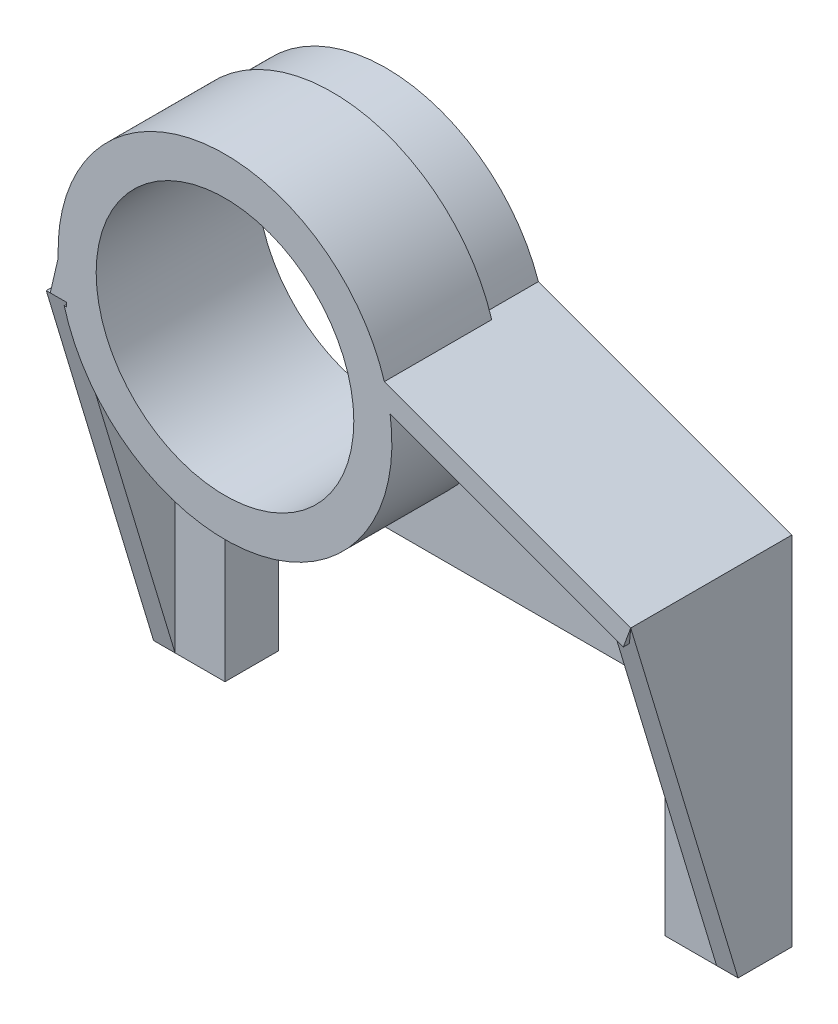
ISO-10303-21;
HEADER;
FILE_DESCRIPTION(('STEP AP214'),'2;1');
FILE_NAME('part.step','',(''),(''),'','','');
FILE_SCHEMA(('AUTOMOTIVE_DESIGN { 1 0 10303 214 1 1 1 1 }'));
ENDSEC;
DATA;
#1=APPLICATION_CONTEXT('core data for automotive mechanical design processes');
#2=APPLICATION_PROTOCOL_DEFINITION('international standard','automotive_design',2000,#1);
#3=PRODUCT_CONTEXT('',#1,'mechanical');
#4=PRODUCT('Part','Part','',(#3));
#5=PRODUCT_RELATED_PRODUCT_CATEGORY('part','',(#4));
#6=PRODUCT_DEFINITION_FORMATION('','',#4);
#7=PRODUCT_DEFINITION_CONTEXT('part definition',#1,'design');
#8=PRODUCT_DEFINITION('design','',#6,#7);
#9=PRODUCT_DEFINITION_SHAPE('','',#8);
#10=(LENGTH_UNIT() NAMED_UNIT(*) SI_UNIT(.MILLI.,.METRE.));
#11=(NAMED_UNIT(*) PLANE_ANGLE_UNIT() SI_UNIT($,.RADIAN.));
#12=(NAMED_UNIT(*) SI_UNIT($,.STERADIAN.) SOLID_ANGLE_UNIT());
#13=UNCERTAINTY_MEASURE_WITH_UNIT(LENGTH_MEASURE(1.E-05),#10,'distance_accuracy_value','');
#14=(GEOMETRIC_REPRESENTATION_CONTEXT(3) GLOBAL_UNCERTAINTY_ASSIGNED_CONTEXT((#13)) GLOBAL_UNIT_ASSIGNED_CONTEXT((#10,
#11,#12)) REPRESENTATION_CONTEXT('',''));
#15=CARTESIAN_POINT('',(0.,0.,0.));
#16=DIRECTION('',(0.,0.,1.));
#17=DIRECTION('',(1.,0.,0.));
#18=AXIS2_PLACEMENT_3D('',#15,#16,#17);
#19=CARTESIAN_POINT('',(-10.4999999999999,27.0627219974459,15.));
#20=DIRECTION('',(0.,0.,-1.));
#21=DIRECTION('',(-1.,0.,0.));
#22=AXIS2_PLACEMENT_3D('',#19,#20,#21);
#23=CYLINDRICAL_SURFACE('',#22,15.5477575567131);
#24=DIRECTION('',(0.,0.,-1.));
#25=VECTOR('',#24,1.);
#26=CARTESIAN_POINT('',(4.87771865813112,29.3558713414047,15.));
#27=LINE('',#26,#25);
#28=CARTESIAN_POINT('',(4.87771865813112,29.3558713414047,15.));
#29=VERTEX_POINT('',#28);
#30=CARTESIAN_POINT('',(4.87771865813112,29.3558713414047,5.));
#31=VERTEX_POINT('',#30);
#32=EDGE_CURVE('E224',#29,#31,#27,.T.);
#33=ORIENTED_EDGE('',*,*,#32,.F.);
#34=CARTESIAN_POINT('',(-10.4999999999999,27.0627219974459,15.));
#35=DIRECTION('',(0.,0.,1.));
#36=DIRECTION('',(1.,0.,0.));
#37=AXIS2_PLACEMENT_3D('',#34,#35,#36);
#38=CIRCLE('',#37,15.5477575567131);
#39=CARTESIAN_POINT('',(-25.4773850163848,22.8901085342437,15.));
#40=VERTEX_POINT('',#39);
#41=EDGE_CURVE('E239',#40,#29,#38,.T.);
#42=ORIENTED_EDGE('',*,*,#41,.F.);
#43=DIRECTION('',(0.,0.,-1.));
#44=VECTOR('',#43,1.);
#45=CARTESIAN_POINT('',(-25.4773850163848,22.8901085342437,14.9999999999991));
#46=LINE('',#45,#44);
#47=CARTESIAN_POINT('',(-25.4773850163848,22.8901085342437,14.8832534168398));
#48=VERTEX_POINT('',#47);
#49=EDGE_CURVE('E11',#40,#48,#46,.T.);
#50=ORIENTED_EDGE('',*,*,#49,.T.);
#51=CARTESIAN_POINT('',(-10.4999999999999,27.0627219974459,16.1388061624931));
#52=DIRECTION('',(0.,-0.288141267617881,0.957587912358735));
#53=DIRECTION('',(0.,-0.957587912358735,-0.288141267617881));
#54=AXIS2_PLACEMENT_3D('',#51,#52,#53);
#55=ELLIPSE('',#54,16.2363761656262,15.5477575567131);
#56=CARTESIAN_POINT('',(-25.1500000000005,21.8559701268159,14.5720778602535));
#57=VERTEX_POINT('',#56);
#58=EDGE_CURVE('E241',#57,#48,#55,.F.);
#59=ORIENTED_EDGE('',*,*,#58,.F.);
#60=DIRECTION('',(0.,0.,-1.));
#61=VECTOR('',#60,1.);
#62=CARTESIAN_POINT('',(-25.1500000000005,21.8559701268159,15.));
#63=LINE('',#62,#61);
#64=CARTESIAN_POINT('',(-25.1500000000005,21.8559701268159,5.));
#65=VERTEX_POINT('',#64);
#66=EDGE_CURVE('E351',#57,#65,#63,.T.);
#67=ORIENTED_EDGE('',*,*,#66,.T.);
#68=CARTESIAN_POINT('',(-10.4999999999999,27.0627219974459,5.));
#69=DIRECTION('',(0.,0.,1.));
#70=DIRECTION('',(1.,0.,0.));
#71=AXIS2_PLACEMENT_3D('',#68,#69,#70);
#72=CIRCLE('',#71,15.5477575567131);
#73=EDGE_CURVE('E238',#65,#31,#72,.T.);
#74=ORIENTED_EDGE('',*,*,#73,.T.);
#75=EDGE_LOOP('',(#33,#42,#50,#59,#67,#74));
#76=FACE_BOUND('',#75,.T.);
#77=ADVANCED_FACE('F32',(#76),#23,.T.);
#78=CARTESIAN_POINT('',(-10.4999999999999,27.0627219974459,5.));
#79=DIRECTION('',(0.,0.,1.));
#80=DIRECTION('',(1.,0.,0.));
#81=AXIS2_PLACEMENT_3D('',#78,#79,#80);
#82=PLANE('',#81);
#83=DIRECTION('',(0.,1.,0.));
#84=VECTOR('',#83,1.);
#85=CARTESIAN_POINT('',(25.2932589024681,-9.9551832387312,5.));
#86=LINE('',#85,#84);
#87=CARTESIAN_POINT('',(25.2932589024681,-9.9551832387312,5.));
#88=VERTEX_POINT('',#87);
#89=CARTESIAN_POINT('',(25.2932589024681,21.8805558147809,5.));
#90=VERTEX_POINT('',#89);
#91=EDGE_CURVE('E272',#88,#90,#86,.T.);
#92=ORIENTED_EDGE('',*,*,#91,.T.);
#93=DIRECTION('',(-0.939030573289437,0.343833655170215,0.));
#94=VECTOR('',#93,1.);
#95=CARTESIAN_POINT('',(26.6055915921277,21.4000345641209,5.));
#96=LINE('',#95,#94);
#97=EDGE_CURVE('E47',#90,#31,#96,.T.);
#98=ORIENTED_EDGE('',*,*,#97,.T.);
#99=ORIENTED_EDGE('',*,*,#73,.F.);
#100=DIRECTION('',(0.,-1.,0.));
#101=VECTOR('',#100,1.);
#102=CARTESIAN_POINT('',(-25.1499999999998,-9.95518323873058,5.));
#103=LINE('',#102,#101);
#104=CARTESIAN_POINT('',(-25.1499999999998,-9.95518323873127,5.));
#105=VERTEX_POINT('',#104);
#106=EDGE_CURVE('E253',#65,#105,#103,.T.);
#107=ORIENTED_EDGE('',*,*,#106,.T.);
#108=DIRECTION('',(1.,0.,0.));
#109=VECTOR('',#108,1.);
#110=CARTESIAN_POINT('',(-27.15,-9.95518323873129,5.));
#111=LINE('',#110,#109);
#112=CARTESIAN_POINT('',(-20.5000000000007,-9.95518323873122,5.));
#113=VERTEX_POINT('',#112);
#114=EDGE_CURVE('E287',#105,#113,#111,.T.);
#115=ORIENTED_EDGE('',*,*,#114,.T.);
#116=DIRECTION('',(0.,1.,0.));
#117=VECTOR('',#116,1.);
#118=CARTESIAN_POINT('',(-20.5000000000007,-9.95518323873122,5.));
#119=LINE('',#118,#117);
#120=CARTESIAN_POINT('',(-20.5000000000007,10.0000000000001,5.));
#121=VERTEX_POINT('',#120);
#122=EDGE_CURVE('E286',#113,#121,#119,.T.);
#123=ORIENTED_EDGE('',*,*,#122,.T.);
#124=DIRECTION('',(1.,0.,0.));
#125=VECTOR('',#124,1.);
#126=CARTESIAN_POINT('',(20.4976937486612,10.0000000000001,5.));
#127=LINE('',#126,#125);
#128=CARTESIAN_POINT('',(20.4976937486612,10.0000000000001,5.));
#129=VERTEX_POINT('',#128);
#130=EDGE_CURVE('E289',#121,#129,#127,.T.);
#131=ORIENTED_EDGE('',*,*,#130,.T.);
#132=DIRECTION('',(0.,-1.,0.));
#133=VECTOR('',#132,1.);
#134=CARTESIAN_POINT('',(20.4976937486612,-9.9551832387312,5.));
#135=LINE('',#134,#133);
#136=CARTESIAN_POINT('',(20.4976937486612,-9.9551832387312,5.));
#137=VERTEX_POINT('',#136);
#138=EDGE_CURVE('E291',#129,#137,#135,.T.);
#139=ORIENTED_EDGE('',*,*,#138,.T.);
#140=DIRECTION('',(1.,0.,0.));
#141=VECTOR('',#140,1.);
#142=CARTESIAN_POINT('',(27.2932589024681,-9.9551832387312,5.));
#143=LINE('',#142,#141);
#144=EDGE_CURVE('E293',#137,#88,#143,.T.);
#145=ORIENTED_EDGE('',*,*,#144,.T.);
#146=EDGE_LOOP('',(#92,#98,#99,#107,#115,#123,#131,#139,#145));
#147=FACE_BOUND('',#146,.T.);
#148=ADVANCED_FACE('F416',(#147),#82,.T.);
#149=CARTESIAN_POINT('',(25.2932589024681,0.,0.));
#150=DIRECTION('',(-1.,0.,0.));
#151=DIRECTION('',(0.,0.,1.));
#152=AXIS2_PLACEMENT_3D('',#149,#150,#151);
#153=PLANE('',#152);
#154=DIRECTION('',(0.,-0.957587912358738,-0.288141267617872));
#155=VECTOR('',#154,1.);
#156=CARTESIAN_POINT('',(25.2932589024681,23.2780957106998,15.));
#157=LINE('',#156,#155);
#158=CARTESIAN_POINT('',(25.2932589024681,21.8805558147809,14.5794757724492));
#159=VERTEX_POINT('',#158);
#160=EDGE_CURVE('E270',#159,#88,#157,.T.);
#161=ORIENTED_EDGE('',*,*,#160,.F.);
#162=DIRECTION('',(0.,0.,-1.));
#163=VECTOR('',#162,1.);
#164=CARTESIAN_POINT('',(25.2932589024681,21.8805558147809,0.));
#165=LINE('',#164,#163);
#166=EDGE_CURVE('E219',#159,#90,#165,.T.);
#167=ORIENTED_EDGE('',*,*,#166,.T.);
#168=ORIENTED_EDGE('',*,*,#91,.F.);
#169=EDGE_LOOP('',(#161,#167,#168));
#170=FACE_BOUND('',#169,.T.);
#171=ADVANCED_FACE('F409',(#170),#153,.T.);
#172=CARTESIAN_POINT('',(-25.1500000000006,23.2780957107005,5.));
#173=DIRECTION('',(0.,1.,1.26634813746307E-13));
#174=DIRECTION('',(0.,-1.26634813746307E-13,1.));
#175=AXIS2_PLACEMENT_3D('',#172,#173,#174);
#176=PLANE('',#175);
#177=DIRECTION('',(-1.,0.,0.));
#178=VECTOR('',#177,1.);
#179=CARTESIAN_POINT('',(-25.1500000000006,23.2780957106992,15.));
#180=LINE('',#179,#178);
#181=CARTESIAN_POINT('',(-26.776167612557,23.2780957106992,15.));
#182=VERTEX_POINT('',#181);
#183=CARTESIAN_POINT('',(-27.1500000000006,23.2780957106991,15.));
#184=VERTEX_POINT('',#183);
#185=EDGE_CURVE('E256',#182,#184,#180,.T.);
#186=ORIENTED_EDGE('',*,*,#185,.F.);
#187=DIRECTION('',(0.,1.26634813746308E-13,-1.));
#188=VECTOR('',#187,1.);
#189=CARTESIAN_POINT('',(-26.7761676125567,23.2780957107004,4.99999999999995));
#190=LINE('',#189,#188);
#191=CARTESIAN_POINT('',(-26.7761676125566,23.2780957107005,5.));
#192=VERTEX_POINT('',#191);
#193=EDGE_CURVE('E232',#182,#192,#190,.T.);
#194=ORIENTED_EDGE('',*,*,#193,.T.);
#195=DIRECTION('',(-1.,0.,0.));
#196=VECTOR('',#195,1.);
#197=CARTESIAN_POINT('',(-25.1500000000006,23.2780957107005,5.));
#198=LINE('',#197,#196);
#199=CARTESIAN_POINT('',(-27.1500000000006,23.2780957107004,5.));
#200=VERTEX_POINT('',#199);
#201=EDGE_CURVE('E264',#192,#200,#198,.T.);
#202=ORIENTED_EDGE('',*,*,#201,.T.);
#203=DIRECTION('',(0.,1.26634813746307E-13,-1.));
#204=VECTOR('',#203,1.);
#205=CARTESIAN_POINT('',(-27.1500000000006,23.2780957107004,5.));
#206=LINE('',#205,#204);
#207=EDGE_CURVE('E259',#184,#200,#206,.T.);
#208=ORIENTED_EDGE('',*,*,#207,.F.);
#209=EDGE_LOOP('',(#186,#194,#202,#208));
#210=FACE_BOUND('',#209,.T.);
#211=ADVANCED_FACE('F388',(#210),#176,.T.);
#212=CARTESIAN_POINT('',(4.34622459284967,31.6803383068634,15.));
#213=VERTEX_POINT('',#212);
#214=CARTESIAN_POINT('',(-26.036356889727,26.4674240574542,15.));
#215=VERTEX_POINT('',#214);
#216=EDGE_CURVE('E55',#213,#215,#38,.T.);
#217=ORIENTED_EDGE('',*,*,#216,.F.);
#218=DIRECTION('',(0.,0.,-1.));
#219=VECTOR('',#218,1.);
#220=CARTESIAN_POINT('',(4.34622459284967,31.6803383068634,15.));
#221=LINE('',#220,#219);
#222=CARTESIAN_POINT('',(4.34622459284967,31.6803383068634,5.));
#223=VERTEX_POINT('',#222);
#224=EDGE_CURVE('E217',#213,#223,#221,.T.);
#225=ORIENTED_EDGE('',*,*,#224,.T.);
#226=CARTESIAN_POINT('',(-26.036356889727,26.4674240574542,5.));
#227=VERTEX_POINT('',#226);
#228=EDGE_CURVE('E242',#223,#227,#72,.T.);
#229=ORIENTED_EDGE('',*,*,#228,.T.);
#230=DIRECTION('',(0.,0.,-1.));
#231=VECTOR('',#230,1.);
#232=CARTESIAN_POINT('',(-26.036356889727,26.4674240574542,15.));
#233=LINE('',#232,#231);
#234=EDGE_CURVE('E40',#215,#227,#233,.T.);
#235=ORIENTED_EDGE('',*,*,#234,.F.);
#236=EDGE_LOOP('',(#217,#225,#229,#235));
#237=FACE_BOUND('',#236,.T.);
#238=ADVANCED_FACE('F359',(#237),#23,.T.);
#239=CARTESIAN_POINT('',(-25.15,-6.11808615426767E-13,0.));
#240=DIRECTION('',(-1.,0.,0.));
#241=DIRECTION('',(0.,-1.,0.));
#242=AXIS2_PLACEMENT_3D('',#239,#240,#241);
#243=PLANE('',#242);
#244=ORIENTED_EDGE('',*,*,#66,.F.);
#245=DIRECTION('',(0.,0.957587912358735,0.288141267617881));
#246=VECTOR('',#245,1.);
#247=CARTESIAN_POINT('',(-25.1500000000006,23.2780957106992,15.));
#248=LINE('',#247,#246);
#249=EDGE_CURVE('E250',#105,#57,#248,.T.);
#250=ORIENTED_EDGE('',*,*,#249,.F.);
#251=ORIENTED_EDGE('',*,*,#106,.F.);
#252=EDGE_LOOP('',(#244,#250,#251));
#253=FACE_BOUND('',#252,.T.);
#254=ADVANCED_FACE('F447',(#253),#243,.F.);
#255=CARTESIAN_POINT('',(-10.4999999999999,27.0627219974459,0.));
#256=DIRECTION('',(0.,0.,1.));
#257=DIRECTION('',(1.,0.,0.));
#258=AXIS2_PLACEMENT_3D('',#255,#256,#257);
#259=PLANE('',#258);
#260=DIRECTION('',(1.,0.,0.));
#261=VECTOR('',#260,1.);
#262=CARTESIAN_POINT('',(-27.15,-9.95518323873129,0.));
#263=LINE('',#262,#261);
#264=CARTESIAN_POINT('',(-27.15,-9.95518323873129,0.));
#265=VERTEX_POINT('',#264);
#266=CARTESIAN_POINT('',(-20.5000000000007,-9.95518323873122,0.));
#267=VERTEX_POINT('',#266);
#268=EDGE_CURVE('E282',#265,#267,#263,.T.);
#269=ORIENTED_EDGE('',*,*,#268,.F.);
#270=DIRECTION('',(0.,-1.,0.));
#271=VECTOR('',#270,1.);
#272=CARTESIAN_POINT('',(-27.15,10.,0.));
#273=LINE('',#272,#271);
#274=CARTESIAN_POINT('',(-27.15,21.66650210518,0.));
#275=VERTEX_POINT('',#274);
#276=EDGE_CURVE('E320',#275,#265,#273,.T.);
#277=ORIENTED_EDGE('',*,*,#276,.F.);
#278=DIRECTION('',(-0.225964776905867,-0.974135472918363,0.));
#279=VECTOR('',#278,1.);
#280=CARTESIAN_POINT('',(-27.15,21.66650210518,0.));
#281=LINE('',#280,#279);
#282=CARTESIAN_POINT('',(-25.1120320937753,30.4521936510339,0.));
#283=VERTEX_POINT('',#282);
#284=EDGE_CURVE('E318',#283,#275,#281,.T.);
#285=ORIENTED_EDGE('',*,*,#284,.F.);
#286=CARTESIAN_POINT('',(-10.4999999999999,27.0627219974459,0.));
#287=DIRECTION('',(0.,0.,1.));
#288=DIRECTION('',(1.,0.,0.));
#289=AXIS2_PLACEMENT_3D('',#286,#287,#288);
#290=CIRCLE('',#289,15.);
#291=CARTESIAN_POINT('',(3.69180162432101,31.9199605808308,0.));
#292=VERTEX_POINT('',#291);
#293=EDGE_CURVE('E316',#292,#283,#290,.T.);
#294=ORIENTED_EDGE('',*,*,#293,.F.);
#295=DIRECTION('',(-0.939030573289437,0.343833655170215,0.));
#296=VECTOR('',#295,1.);
#297=CARTESIAN_POINT('',(3.69180162432101,31.9199605808308,0.));
#298=LINE('',#297,#296);
#299=CARTESIAN_POINT('',(27.2932589024681,23.2780957106998,0.));
#300=VERTEX_POINT('',#299);
#301=EDGE_CURVE('E314',#300,#292,#298,.T.);
#302=ORIENTED_EDGE('',*,*,#301,.F.);
#303=DIRECTION('',(0.,1.,0.));
#304=VECTOR('',#303,1.);
#305=CARTESIAN_POINT('',(27.2932589024681,10.0000000000001,0.));
#306=LINE('',#305,#304);
#307=CARTESIAN_POINT('',(27.2932589024681,-9.9551832387312,0.));
#308=VERTEX_POINT('',#307);
#309=EDGE_CURVE('E312',#308,#300,#306,.T.);
#310=ORIENTED_EDGE('',*,*,#309,.F.);
#311=DIRECTION('',(1.,0.,0.));
#312=VECTOR('',#311,1.);
#313=CARTESIAN_POINT('',(27.2932589024681,-9.9551832387312,0.));
#314=LINE('',#313,#312);
#315=CARTESIAN_POINT('',(20.4976937486612,-9.9551832387312,0.));
#316=VERTEX_POINT('',#315);
#317=EDGE_CURVE('E309',#316,#308,#314,.T.);
#318=ORIENTED_EDGE('',*,*,#317,.F.);
#319=DIRECTION('',(0.,-1.,0.));
#320=VECTOR('',#319,1.);
#321=CARTESIAN_POINT('',(20.4976937486612,-9.9551832387312,0.));
#322=LINE('',#321,#320);
#323=CARTESIAN_POINT('',(20.4976937486612,10.0000000000001,0.));
#324=VERTEX_POINT('',#323);
#325=EDGE_CURVE('E307',#324,#316,#322,.T.);
#326=ORIENTED_EDGE('',*,*,#325,.F.);
#327=DIRECTION('',(1.,0.,0.));
#328=VECTOR('',#327,1.);
#329=CARTESIAN_POINT('',(20.4976937486612,10.0000000000001,0.));
#330=LINE('',#329,#328);
#331=CARTESIAN_POINT('',(-20.5000000000007,10.0000000000001,0.));
#332=VERTEX_POINT('',#331);
#333=EDGE_CURVE('E305',#332,#324,#330,.T.);
#334=ORIENTED_EDGE('',*,*,#333,.F.);
#335=DIRECTION('',(0.,1.,0.));
#336=VECTOR('',#335,1.);
#337=CARTESIAN_POINT('',(-20.5000000000007,-9.95518323873122,0.));
#338=LINE('',#337,#336);
#339=EDGE_CURVE('E303',#267,#332,#338,.T.);
#340=ORIENTED_EDGE('',*,*,#339,.F.);
#341=EDGE_LOOP('',(#269,#277,#285,#294,#302,#310,#318,#326,#334,#340));
#342=FACE_BOUND('',#341,.T.);
#343=CARTESIAN_POINT('',(-10.4999999999999,27.0627219974459,0.));
#344=DIRECTION('',(0.,0.,1.));
#345=DIRECTION('',(1.,0.,0.));
#346=AXIS2_PLACEMENT_3D('',#343,#344,#345);
#347=CIRCLE('',#346,12.);
#348=CARTESIAN_POINT('',(1.50000000000012,27.0627219974459,0.));
#349=VERTEX_POINT('',#348);
#350=EDGE_CURVE('E279',#349,#349,#347,.T.);
#351=ORIENTED_EDGE('',*,*,#350,.T.);
#352=EDGE_LOOP('',(#351));
#353=FACE_BOUND('',#352,.T.);
#354=ADVANCED_FACE('F373',(#342,#353),#259,.F.);
#355=CARTESIAN_POINT('',(-27.15,-9.95518323873129,5.));
#356=DIRECTION('',(0.,1.,0.));
#357=DIRECTION('',(-1.,0.,0.));
#358=AXIS2_PLACEMENT_3D('',#355,#356,#357);
#359=PLANE('',#358);
#360=ORIENTED_EDGE('',*,*,#268,.T.);
#361=DIRECTION('',(0.,0.,-1.));
#362=VECTOR('',#361,1.);
#363=CARTESIAN_POINT('',(-20.5000000000007,-9.95518323873122,5.));
#364=LINE('',#363,#362);
#365=EDGE_CURVE('E345',#113,#267,#364,.T.);
#366=ORIENTED_EDGE('',*,*,#365,.F.);
#367=ORIENTED_EDGE('',*,*,#114,.F.);
#368=CARTESIAN_POINT('',(-27.1499999999998,-9.95518323873063,5.));
#369=VERTEX_POINT('',#368);
#370=EDGE_CURVE('E283',#369,#105,#111,.T.);
#371=ORIENTED_EDGE('',*,*,#370,.F.);
#372=DIRECTION('',(0.,0.,-1.));
#373=VECTOR('',#372,1.);
#374=CARTESIAN_POINT('',(-27.15,-9.95518323873129,5.));
#375=LINE('',#374,#373);
#376=EDGE_CURVE('E348',#369,#265,#375,.T.);
#377=ORIENTED_EDGE('',*,*,#376,.T.);
#378=EDGE_LOOP('',(#360,#366,#367,#371,#377));
#379=FACE_BOUND('',#378,.T.);
#380=ADVANCED_FACE('F34',(#379),#359,.F.);
#381=CARTESIAN_POINT('',(-20.5000000000007,-9.95518323873122,5.));
#382=DIRECTION('',(-1.,0.,0.));
#383=DIRECTION('',(0.,0.,1.));
#384=AXIS2_PLACEMENT_3D('',#381,#382,#383);
#385=PLANE('',#384);
#386=ORIENTED_EDGE('',*,*,#339,.T.);
#387=DIRECTION('',(0.,0.,-1.));
#388=VECTOR('',#387,1.);
#389=CARTESIAN_POINT('',(-20.5000000000007,10.0000000000001,5.));
#390=LINE('',#389,#388);
#391=EDGE_CURVE('E342',#121,#332,#390,.T.);
#392=ORIENTED_EDGE('',*,*,#391,.F.);
#393=ORIENTED_EDGE('',*,*,#122,.F.);
#394=ORIENTED_EDGE('',*,*,#365,.T.);
#395=EDGE_LOOP('',(#386,#392,#393,#394));
#396=FACE_BOUND('',#395,.T.);
#397=ADVANCED_FACE('F613',(#396),#385,.F.);
#398=CARTESIAN_POINT('',(20.4976937486612,10.0000000000001,5.));
#399=DIRECTION('',(0.,1.,0.));
#400=DIRECTION('',(-1.,0.,0.));
#401=AXIS2_PLACEMENT_3D('',#398,#399,#400);
#402=PLANE('',#401);
#403=ORIENTED_EDGE('',*,*,#333,.T.);
#404=DIRECTION('',(0.,0.,-1.));
#405=VECTOR('',#404,1.);
#406=CARTESIAN_POINT('',(20.4976937486612,10.0000000000001,5.));
#407=LINE('',#406,#405);
#408=EDGE_CURVE('E339',#129,#324,#407,.T.);
#409=ORIENTED_EDGE('',*,*,#408,.F.);
#410=ORIENTED_EDGE('',*,*,#130,.F.);
#411=ORIENTED_EDGE('',*,*,#391,.T.);
#412=EDGE_LOOP('',(#403,#409,#410,#411));
#413=FACE_BOUND('',#412,.T.);
#414=ADVANCED_FACE('F606',(#413),#402,.F.);
#415=CARTESIAN_POINT('',(20.4976937486612,-9.9551832387312,5.));
#416=DIRECTION('',(1.,0.,0.));
#417=DIRECTION('',(0.,0.,-1.));
#418=AXIS2_PLACEMENT_3D('',#415,#416,#417);
#419=PLANE('',#418);
#420=ORIENTED_EDGE('',*,*,#325,.T.);
#421=DIRECTION('',(0.,0.,-1.));
#422=VECTOR('',#421,1.);
#423=CARTESIAN_POINT('',(20.4976937486612,-9.9551832387312,5.));
#424=LINE('',#423,#422);
#425=EDGE_CURVE('E336',#137,#316,#424,.T.);
#426=ORIENTED_EDGE('',*,*,#425,.F.);
#427=ORIENTED_EDGE('',*,*,#138,.F.);
#428=ORIENTED_EDGE('',*,*,#408,.T.);
#429=EDGE_LOOP('',(#420,#426,#427,#428));
#430=FACE_BOUND('',#429,.T.);
#431=ADVANCED_FACE('F422',(#430),#419,.F.);
#432=CARTESIAN_POINT('',(27.2932589024681,-9.9551832387312,5.));
#433=DIRECTION('',(0.,1.,0.));
#434=DIRECTION('',(0.,0.,1.));
#435=AXIS2_PLACEMENT_3D('',#432,#433,#434);
#436=PLANE('',#435);
#437=ORIENTED_EDGE('',*,*,#317,.T.);
#438=DIRECTION('',(0.,0.,-1.));
#439=VECTOR('',#438,1.);
#440=CARTESIAN_POINT('',(27.2932589024681,-9.9551832387312,5.));
#441=LINE('',#440,#439);
#442=CARTESIAN_POINT('',(27.2932589024681,-9.9551832387312,5.));
#443=VERTEX_POINT('',#442);
#444=EDGE_CURVE('E333',#443,#308,#441,.T.);
#445=ORIENTED_EDGE('',*,*,#444,.F.);
#446=DIRECTION('',(1.,0.,0.));
#447=VECTOR('',#446,1.);
#448=CARTESIAN_POINT('',(25.2932589024681,-9.9551832387312,5.));
#449=LINE('',#448,#447);
#450=EDGE_CURVE('E275',#88,#443,#449,.T.);
#451=ORIENTED_EDGE('',*,*,#450,.F.);
#452=ORIENTED_EDGE('',*,*,#144,.F.);
#453=ORIENTED_EDGE('',*,*,#425,.T.);
#454=EDGE_LOOP('',(#437,#445,#451,#452,#453));
#455=FACE_BOUND('',#454,.T.);
#456=ADVANCED_FACE('F415',(#455),#436,.F.);
#457=CARTESIAN_POINT('',(27.2932589024681,10.0000000000001,5.));
#458=DIRECTION('',(-1.,0.,0.));
#459=DIRECTION('',(0.,0.,1.));
#460=AXIS2_PLACEMENT_3D('',#457,#458,#459);
#461=PLANE('',#460);
#462=ORIENTED_EDGE('',*,*,#309,.T.);
#463=DIRECTION('',(0.,0.,-1.));
#464=VECTOR('',#463,1.);
#465=CARTESIAN_POINT('',(27.2932589024681,23.2780957106998,5.));
#466=LINE('',#465,#464);
#467=CARTESIAN_POINT('',(27.2932589024681,23.2780957106998,15.));
#468=VERTEX_POINT('',#467);
#469=EDGE_CURVE('E330',#468,#300,#466,.T.);
#470=ORIENTED_EDGE('',*,*,#469,.F.);
#471=DIRECTION('',(0.,-0.957587912358738,-0.288141267617872));
#472=VECTOR('',#471,1.);
#473=CARTESIAN_POINT('',(27.2932589024681,23.2780957106998,15.));
#474=LINE('',#473,#472);
#475=EDGE_CURVE('E269',#468,#443,#474,.T.);
#476=ORIENTED_EDGE('',*,*,#475,.T.);
#477=ORIENTED_EDGE('',*,*,#444,.T.);
#478=EDGE_LOOP('',(#462,#470,#476,#477));
#479=FACE_BOUND('',#478,.T.);
#480=ADVANCED_FACE('F427',(#479),#461,.F.);
#481=CARTESIAN_POINT('',(3.69180162432101,31.9199605808308,5.));
#482=DIRECTION('',(-0.343833655170215,-0.939030573289437,0.));
#483=DIRECTION('',(0.939030573289437,-0.343833655170215,0.));
#484=AXIS2_PLACEMENT_3D('',#481,#482,#483);
#485=PLANE('',#484);
#486=ORIENTED_EDGE('',*,*,#301,.T.);
#487=DIRECTION('',(0.,0.,-1.));
#488=VECTOR('',#487,1.);
#489=CARTESIAN_POINT('',(3.69180162432101,31.9199605808308,5.));
#490=LINE('',#489,#488);
#491=CARTESIAN_POINT('',(3.69180162432101,31.9199605808308,5.));
#492=VERTEX_POINT('',#491);
#493=EDGE_CURVE('E327',#492,#292,#490,.T.);
#494=ORIENTED_EDGE('',*,*,#493,.F.);
#495=DIRECTION('',(-0.939030573289437,0.343833655170215,0.));
#496=VECTOR('',#495,1.);
#497=CARTESIAN_POINT('',(3.69180162432101,31.9199605808308,5.));
#498=LINE('',#497,#496);
#499=EDGE_CURVE('E246',#223,#492,#498,.T.);
#500=ORIENTED_EDGE('',*,*,#499,.F.);
#501=ORIENTED_EDGE('',*,*,#224,.F.);
#502=DIRECTION('',(0.939030573289437,-0.343833655170215,0.));
#503=VECTOR('',#502,1.);
#504=CARTESIAN_POINT('',(27.2932589024681,23.2780957106998,15.));
#505=LINE('',#504,#503);
#506=EDGE_CURVE('E205',#213,#468,#505,.T.);
#507=ORIENTED_EDGE('',*,*,#506,.T.);
#508=ORIENTED_EDGE('',*,*,#469,.T.);
#509=EDGE_LOOP('',(#486,#494,#500,#501,#507,#508));
#510=FACE_BOUND('',#509,.T.);
#511=ADVANCED_FACE('F429',(#510),#485,.F.);
#512=CARTESIAN_POINT('',(-10.4999999999999,27.0627219974459,5.));
#513=DIRECTION('',(0.,0.,-1.));
#514=DIRECTION('',(-1.,0.,0.));
#515=AXIS2_PLACEMENT_3D('',#512,#513,#514);
#516=CYLINDRICAL_SURFACE('',#515,15.);
#517=ORIENTED_EDGE('',*,*,#293,.T.);
#518=DIRECTION('',(0.,0.,-1.));
#519=VECTOR('',#518,1.);
#520=CARTESIAN_POINT('',(-25.1120320937753,30.4521936510339,5.));
#521=LINE('',#520,#519);
#522=CARTESIAN_POINT('',(-25.1120320937753,30.4521936510339,5.));
#523=VERTEX_POINT('',#522);
#524=EDGE_CURVE('E324',#523,#283,#521,.T.);
#525=ORIENTED_EDGE('',*,*,#524,.F.);
#526=CARTESIAN_POINT('',(-10.4999999999999,27.0627219974459,5.));
#527=DIRECTION('',(0.,0.,1.));
#528=DIRECTION('',(1.,0.,0.));
#529=AXIS2_PLACEMENT_3D('',#526,#527,#528);
#530=CIRCLE('',#529,15.);
#531=EDGE_CURVE('E296',#492,#523,#530,.T.);
#532=ORIENTED_EDGE('',*,*,#531,.F.);
#533=ORIENTED_EDGE('',*,*,#493,.T.);
#534=EDGE_LOOP('',(#517,#525,#532,#533));
#535=FACE_BOUND('',#534,.T.);
#536=ADVANCED_FACE('F367',(#535),#516,.T.);
#537=CARTESIAN_POINT('',(-27.15,21.66650210518,5.));
#538=DIRECTION('',(0.974135472918363,-0.225964776905867,0.));
#539=DIRECTION('',(0.225964776905867,0.974135472918363,0.));
#540=AXIS2_PLACEMENT_3D('',#537,#538,#539);
#541=PLANE('',#540);
#542=ORIENTED_EDGE('',*,*,#284,.T.);
#543=DIRECTION('',(0.,0.,-1.));
#544=VECTOR('',#543,1.);
#545=CARTESIAN_POINT('',(-27.15,21.66650210518,5.));
#546=LINE('',#545,#544);
#547=CARTESIAN_POINT('',(-27.15,21.66650210518,5.));
#548=VERTEX_POINT('',#547);
#549=EDGE_CURVE('E301',#548,#275,#546,.T.);
#550=ORIENTED_EDGE('',*,*,#549,.F.);
#551=DIRECTION('',(0.225964776905867,0.974135472918363,0.));
#552=VECTOR('',#551,1.);
#553=CARTESIAN_POINT('',(-27.15,21.66650210518,5.));
#554=LINE('',#553,#552);
#555=EDGE_CURVE('E266',#548,#192,#554,.T.);
#556=ORIENTED_EDGE('',*,*,#555,.T.);
#557=ORIENTED_EDGE('',*,*,#193,.F.);
#558=DIRECTION('',(0.225964776905866,0.974135472918363,0.));
#559=VECTOR('',#558,1.);
#560=CARTESIAN_POINT('',(-24.7572876180919,31.9814991574805,15.));
#561=LINE('',#560,#559);
#562=EDGE_CURVE('E229',#182,#215,#561,.T.);
#563=ORIENTED_EDGE('',*,*,#562,.T.);
#564=ORIENTED_EDGE('',*,*,#234,.T.);
#565=DIRECTION('',(-0.225964776905867,-0.974135472918363,0.));
#566=VECTOR('',#565,1.);
#567=CARTESIAN_POINT('',(-27.15,21.66650210518,5.));
#568=LINE('',#567,#566);
#569=EDGE_CURVE('E298',#523,#227,#568,.T.);
#570=ORIENTED_EDGE('',*,*,#569,.F.);
#571=ORIENTED_EDGE('',*,*,#524,.T.);
#572=EDGE_LOOP('',(#542,#550,#556,#557,#563,#564,#570,#571));
#573=FACE_BOUND('',#572,.T.);
#574=ADVANCED_FACE('F356',(#573),#541,.F.);
#575=CARTESIAN_POINT('',(-27.15,10.,5.));
#576=DIRECTION('',(1.,0.,0.));
#577=DIRECTION('',(0.,0.,-1.));
#578=AXIS2_PLACEMENT_3D('',#575,#576,#577);
#579=PLANE('',#578);
#580=ORIENTED_EDGE('',*,*,#276,.T.);
#581=ORIENTED_EDGE('',*,*,#376,.F.);
#582=DIRECTION('',(0.,0.957587912358735,0.288141267617881));
#583=VECTOR('',#582,1.);
#584=CARTESIAN_POINT('',(-27.1500000000006,23.2780957106991,15.));
#585=LINE('',#584,#583);
#586=EDGE_CURVE('E249',#369,#184,#585,.T.);
#587=ORIENTED_EDGE('',*,*,#586,.T.);
#588=ORIENTED_EDGE('',*,*,#207,.T.);
#589=DIRECTION('',(0.,-1.,0.));
#590=VECTOR('',#589,1.);
#591=CARTESIAN_POINT('',(-27.1499999999998,-9.95518323873063,5.));
#592=LINE('',#591,#590);
#593=EDGE_CURVE('E254',#200,#548,#592,.T.);
#594=ORIENTED_EDGE('',*,*,#593,.T.);
#595=ORIENTED_EDGE('',*,*,#549,.T.);
#596=EDGE_LOOP('',(#580,#581,#587,#588,#594,#595));
#597=FACE_BOUND('',#596,.T.);
#598=ADVANCED_FACE('F378',(#597),#579,.F.);
#599=CARTESIAN_POINT('',(-10.4999999999999,27.0627219974459,5.));
#600=DIRECTION('',(0.,0.,-1.));
#601=DIRECTION('',(-1.,0.,0.));
#602=AXIS2_PLACEMENT_3D('',#599,#600,#601);
#603=CYLINDRICAL_SURFACE('',#602,12.);
#604=ORIENTED_EDGE('',*,*,#350,.F.);
#605=EDGE_LOOP('',(#604));
#606=FACE_BOUND('',#605,.T.);
#607=CARTESIAN_POINT('',(-10.4999999999999,27.0627219974459,15.));
#608=DIRECTION('',(0.,0.,1.));
#609=DIRECTION('',(1.,0.,0.));
#610=AXIS2_PLACEMENT_3D('',#607,#608,#609);
#611=CIRCLE('',#610,12.);
#612=CARTESIAN_POINT('',(1.50000000000012,27.0627219974459,15.));
#613=VERTEX_POINT('',#612);
#614=EDGE_CURVE('E235',#613,#613,#611,.T.);
#615=ORIENTED_EDGE('',*,*,#614,.T.);
#616=EDGE_LOOP('',(#615));
#617=FACE_BOUND('',#616,.T.);
#618=ADVANCED_FACE('F464',(#606,#617),#603,.F.);
#619=CARTESIAN_POINT('',(25.2932589024681,23.2780957106998,15.));
#620=DIRECTION('',(0.,-0.288141267617872,0.957587912358738));
#621=DIRECTION('',(0.,-0.957587912358738,-0.288141267617872));
#622=AXIS2_PLACEMENT_3D('',#619,#620,#621);
#623=PLANE('',#622);
#624=DIRECTION('',(0.33087880919161,0.903650102927559,0.271911208130437));
#625=VECTOR('',#624,1.);
#626=CARTESIAN_POINT('',(27.074297329724,22.6800983707347,14.8200606864959));
#627=LINE('',#626,#625);
#628=CARTESIAN_POINT('',(26.6055915921277,21.4000345641209,14.4348853902028));
#629=VERTEX_POINT('',#628);
#630=EDGE_CURVE('E226',#629,#468,#627,.T.);
#631=ORIENTED_EDGE('',*,*,#630,.F.);
#632=DIRECTION('',(-0.934044822597043,0.342008082145124,0.102911326524697));
#633=VECTOR('',#632,1.);
#634=CARTESIAN_POINT('',(24.806391171833,22.0588263803731,14.6331179561963));
#635=LINE('',#634,#633);
#636=EDGE_CURVE('E221',#629,#159,#635,.T.);
#637=ORIENTED_EDGE('',*,*,#636,.T.);
#638=ORIENTED_EDGE('',*,*,#160,.T.);
#639=ORIENTED_EDGE('',*,*,#450,.T.);
#640=ORIENTED_EDGE('',*,*,#475,.F.);
#641=EDGE_LOOP('',(#631,#637,#638,#639,#640));
#642=FACE_BOUND('',#641,.T.);
#643=ADVANCED_FACE('F406',(#642),#623,.T.);
#644=CARTESIAN_POINT('',(-25.1499999999998,-9.95518323873058,5.));
#645=DIRECTION('',(0.,0.,-1.));
#646=DIRECTION('',(-1.,0.,0.));
#647=AXIS2_PLACEMENT_3D('',#644,#645,#646);
#648=PLANE('',#647);
#649=ORIENTED_EDGE('',*,*,#555,.F.);
#650=ORIENTED_EDGE('',*,*,#593,.F.);
#651=ORIENTED_EDGE('',*,*,#201,.F.);
#652=EDGE_LOOP('',(#649,#650,#651));
#653=FACE_BOUND('',#652,.T.);
#654=ADVANCED_FACE('F384',(#653),#648,.T.);
#655=CARTESIAN_POINT('',(-25.1500000000006,23.2780957106992,15.));
#656=DIRECTION('',(0.,-0.288141267617881,0.957587912358735));
#657=DIRECTION('',(0.,-0.957587912358735,-0.288141267617881));
#658=AXIS2_PLACEMENT_3D('',#655,#656,#657);
#659=PLANE('',#658);
#660=ORIENTED_EDGE('',*,*,#185,.T.);
#661=ORIENTED_EDGE('',*,*,#586,.F.);
#662=ORIENTED_EDGE('',*,*,#370,.T.);
#663=ORIENTED_EDGE('',*,*,#249,.T.);
#664=ORIENTED_EDGE('',*,*,#58,.T.);
#665=DIRECTION('',(-1.,0.,0.));
#666=VECTOR('',#665,1.);
#667=CARTESIAN_POINT('',(-25.2773850163848,22.8901085342437,14.8832534168398));
#668=LINE('',#667,#666);
#669=CARTESIAN_POINT('',(-25.2773850163848,22.8901085342437,14.8832534168398));
#670=VERTEX_POINT('',#669);
#671=EDGE_CURVE('E188',#670,#48,#668,.T.);
#672=ORIENTED_EDGE('',*,*,#671,.F.);
#673=DIRECTION('',(0.,-0.957587912358681,-0.288141267618061));
#674=VECTOR('',#673,1.);
#675=CARTESIAN_POINT('',(-25.2773850163848,23.2780957106986,14.9999999999999));
#676=LINE('',#675,#674);
#677=CARTESIAN_POINT('',(-25.2773850163848,23.2780957106986,14.9999999999999));
#678=VERTEX_POINT('',#677);
#679=EDGE_CURVE('E189',#678,#670,#676,.T.);
#680=ORIENTED_EDGE('',*,*,#679,.F.);
#681=DIRECTION('',(-1.,0.,0.));
#682=VECTOR('',#681,1.);
#683=CARTESIAN_POINT('',(-10.4999999999997,23.2780957106999,15.));
#684=LINE('',#683,#682);
#685=EDGE_CURVE('E199',#678,#182,#684,.T.);
#686=ORIENTED_EDGE('',*,*,#685,.T.);
#687=EDGE_LOOP('',(#660,#661,#662,#663,#664,#672,#680,#686));
#688=FACE_BOUND('',#687,.T.);
#689=ADVANCED_FACE('F391',(#688),#659,.T.);
#690=CARTESIAN_POINT('',(-10.4999999999999,27.0627219974459,5.));
#691=DIRECTION('',(0.,0.,1.));
#692=DIRECTION('',(1.,0.,0.));
#693=AXIS2_PLACEMENT_3D('',#690,#691,#692);
#694=PLANE('',#693);
#695=ORIENTED_EDGE('',*,*,#531,.T.);
#696=ORIENTED_EDGE('',*,*,#569,.T.);
#697=ORIENTED_EDGE('',*,*,#228,.F.);
#698=ORIENTED_EDGE('',*,*,#499,.T.);
#699=EDGE_LOOP('',(#695,#696,#697,#698));
#700=FACE_BOUND('',#699,.T.);
#701=ADVANCED_FACE('F363',(#700),#694,.F.);
#702=CARTESIAN_POINT('',(-10.4999999999999,27.0627219974459,15.));
#703=DIRECTION('',(0.,0.,1.));
#704=DIRECTION('',(1.,0.,0.));
#705=AXIS2_PLACEMENT_3D('',#702,#703,#704);
#706=PLANE('',#705);
#707=DIRECTION('',(-1.,0.,0.));
#708=VECTOR('',#707,1.);
#709=CARTESIAN_POINT('',(-25.2773850163848,22.8901085342437,15.));
#710=LINE('',#709,#708);
#711=CARTESIAN_POINT('',(-25.2773850163848,22.8901085342437,15.));
#712=VERTEX_POINT('',#711);
#713=EDGE_CURVE('E180',#712,#40,#710,.T.);
#714=ORIENTED_EDGE('',*,*,#713,.T.);
#715=ORIENTED_EDGE('',*,*,#41,.T.);
#716=DIRECTION('',(0.939030573289437,-0.343833655170215,0.));
#717=VECTOR('',#716,1.);
#718=CARTESIAN_POINT('',(26.6055915921277,21.4000345641209,15.));
#719=LINE('',#718,#717);
#720=CARTESIAN_POINT('',(26.6055915921277,21.4000345641209,15.));
#721=VERTEX_POINT('',#720);
#722=EDGE_CURVE('E210',#29,#721,#719,.T.);
#723=ORIENTED_EDGE('',*,*,#722,.T.);
#724=DIRECTION('',(0.343833655170215,0.939030573289437,0.));
#725=VECTOR('',#724,1.);
#726=CARTESIAN_POINT('',(26.6055915921277,21.4000345641209,15.));
#727=LINE('',#726,#725);
#728=EDGE_CURVE('E212',#721,#468,#727,.T.);
#729=ORIENTED_EDGE('',*,*,#728,.T.);
#730=ORIENTED_EDGE('',*,*,#506,.F.);
#731=ORIENTED_EDGE('',*,*,#216,.T.);
#732=ORIENTED_EDGE('',*,*,#562,.F.);
#733=ORIENTED_EDGE('',*,*,#685,.F.);
#734=DIRECTION('',(0.,1.,-2.86149412145392E-13));
#735=VECTOR('',#734,1.);
#736=CARTESIAN_POINT('',(-25.2773850163848,22.8901085342437,15.));
#737=LINE('',#736,#735);
#738=EDGE_CURVE('E194',#712,#678,#737,.T.);
#739=ORIENTED_EDGE('',*,*,#738,.F.);
#740=EDGE_LOOP('',(#714,#715,#723,#729,#730,#731,#732,#733,#739));
#741=FACE_BOUND('',#740,.T.);
#742=ORIENTED_EDGE('',*,*,#614,.F.);
#743=EDGE_LOOP('',(#742));
#744=FACE_BOUND('',#743,.T.);
#745=ADVANCED_FACE('F197',(#741,#744),#706,.T.);
#746=CARTESIAN_POINT('',(10.0547910258521,27.4602443342471,0.));
#747=DIRECTION('',(0.343833655170215,0.939030573289438,0.));
#748=DIRECTION('',(-0.939030573289438,0.343833655170215,0.));
#749=AXIS2_PLACEMENT_3D('',#746,#747,#748);
#750=PLANE('',#749);
#751=ORIENTED_EDGE('',*,*,#722,.F.);
#752=ORIENTED_EDGE('',*,*,#32,.T.);
#753=ORIENTED_EDGE('',*,*,#97,.F.);
#754=ORIENTED_EDGE('',*,*,#166,.F.);
#755=ORIENTED_EDGE('',*,*,#636,.F.);
#756=DIRECTION('',(0.,0.,-1.));
#757=VECTOR('',#756,1.);
#758=CARTESIAN_POINT('',(26.6055915921277,21.4000345641209,15.));
#759=LINE('',#758,#757);
#760=EDGE_CURVE('E206',#721,#629,#759,.T.);
#761=ORIENTED_EDGE('',*,*,#760,.F.);
#762=EDGE_LOOP('',(#751,#752,#753,#754,#755,#761));
#763=FACE_BOUND('',#762,.T.);
#764=ADVANCED_FACE('F403',(#763),#750,.F.);
#765=CARTESIAN_POINT('',(26.6055915921277,21.4000345641209,15.));
#766=DIRECTION('',(0.939030573289437,-0.343833655170215,0.));
#767=DIRECTION('',(0.343833655170215,0.939030573289437,0.));
#768=AXIS2_PLACEMENT_3D('',#765,#766,#767);
#769=PLANE('',#768);
#770=ORIENTED_EDGE('',*,*,#760,.T.);
#771=ORIENTED_EDGE('',*,*,#630,.T.);
#772=ORIENTED_EDGE('',*,*,#728,.F.);
#773=EDGE_LOOP('',(#770,#771,#772));
#774=FACE_BOUND('',#773,.T.);
#775=ADVANCED_FACE('F401',(#774),#769,.T.);
#776=CARTESIAN_POINT('',(-25.2773850163848,22.8901085342437,14.8832534168398));
#777=DIRECTION('',(0.,-1.,-1.1887104043785E-13));
#778=DIRECTION('',(0.,1.1887104043785E-13,-1.));
#779=AXIS2_PLACEMENT_3D('',#776,#777,#778);
#780=PLANE('',#779);
#781=ORIENTED_EDGE('',*,*,#49,.F.);
#782=ORIENTED_EDGE('',*,*,#713,.F.);
#783=DIRECTION('',(0.,-1.1887104043785E-13,1.));
#784=VECTOR('',#783,1.);
#785=CARTESIAN_POINT('',(-25.2773850163848,22.8901085342437,14.8832534168398));
#786=LINE('',#785,#784);
#787=EDGE_CURVE('E183',#670,#712,#786,.T.);
#788=ORIENTED_EDGE('',*,*,#787,.F.);
#789=ORIENTED_EDGE('',*,*,#671,.T.);
#790=EDGE_LOOP('',(#781,#782,#788,#789));
#791=FACE_BOUND('',#790,.T.);
#792=ADVANCED_FACE('F182',(#791),#780,.F.);
#793=CARTESIAN_POINT('',(-25.2773850163839,-4.54577648817533E-13,-7.59802123065088E-13));
#794=DIRECTION('',(-1.,0.,0.));
#795=DIRECTION('',(0.,0.,1.));
#796=AXIS2_PLACEMENT_3D('',#793,#794,#795);
#797=PLANE('',#796);
#798=ORIENTED_EDGE('',*,*,#787,.T.);
#799=ORIENTED_EDGE('',*,*,#738,.T.);
#800=ORIENTED_EDGE('',*,*,#679,.T.);
#801=EDGE_LOOP('',(#798,#799,#800));
#802=FACE_BOUND('',#801,.T.);
#803=ADVANCED_FACE('F193',(#802),#797,.T.);
#804=CLOSED_SHELL('',(#77,#148,#171,#211,#238,#254,#354,#380,#397,#414,#431,#456,#480,#511,#536,
#574,#598,#618,#643,#654,#689,#701,#745,#764,#775,#792,#803));
#805=MANIFOLD_SOLID_BREP('B2',#804);
#806=ADVANCED_BREP_SHAPE_REPRESENTATION('',(#18,#805),#14);
#807=SHAPE_DEFINITION_REPRESENTATION(#9,#806);
ENDSEC;
END-ISO-10303-21;
